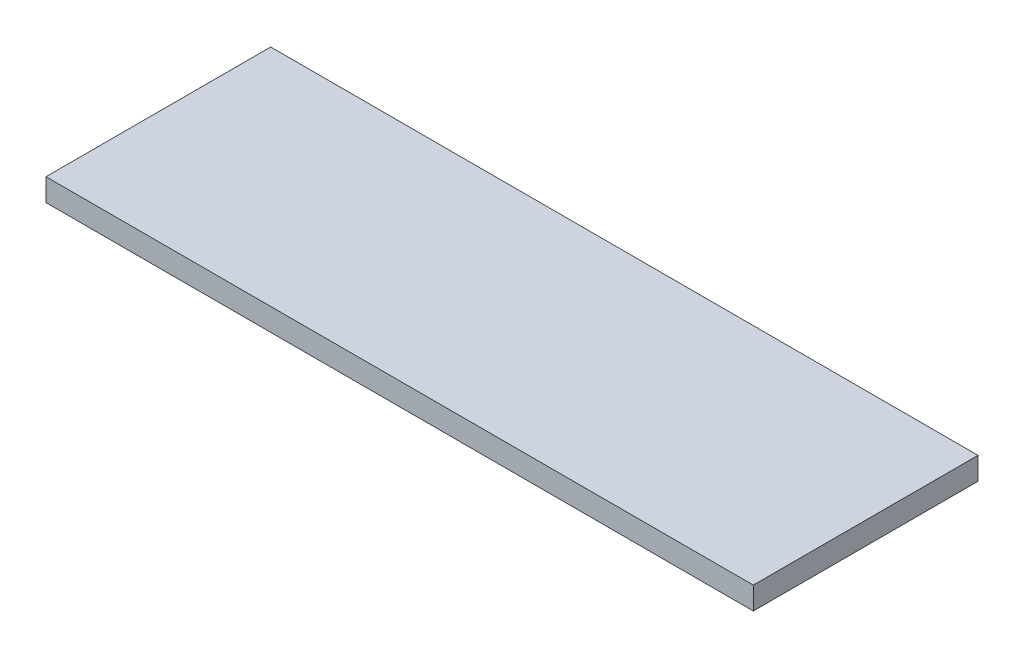
ISO-10303-21;
HEADER;
FILE_DESCRIPTION(('STEP AP214'),'2;1');
FILE_NAME('part.step','',(''),(''),'','','');
FILE_SCHEMA(('AUTOMOTIVE_DESIGN { 1 0 10303 214 1 1 1 1 }'));
ENDSEC;
DATA;
#1=APPLICATION_CONTEXT('core data for automotive mechanical design processes');
#2=APPLICATION_PROTOCOL_DEFINITION('international standard','automotive_design',2000,#1);
#3=PRODUCT_CONTEXT('',#1,'mechanical');
#4=PRODUCT('Part','Part','',(#3));
#5=PRODUCT_RELATED_PRODUCT_CATEGORY('part','',(#4));
#6=PRODUCT_DEFINITION_FORMATION('','',#4);
#7=PRODUCT_DEFINITION_CONTEXT('part definition',#1,'design');
#8=PRODUCT_DEFINITION('design','',#6,#7);
#9=PRODUCT_DEFINITION_SHAPE('','',#8);
#10=(LENGTH_UNIT() NAMED_UNIT(*) SI_UNIT(.MILLI.,.METRE.));
#11=(NAMED_UNIT(*) PLANE_ANGLE_UNIT() SI_UNIT($,.RADIAN.));
#12=(NAMED_UNIT(*) SI_UNIT($,.STERADIAN.) SOLID_ANGLE_UNIT());
#13=UNCERTAINTY_MEASURE_WITH_UNIT(LENGTH_MEASURE(1.E-05),#10,'distance_accuracy_value','');
#14=(GEOMETRIC_REPRESENTATION_CONTEXT(3) GLOBAL_UNCERTAINTY_ASSIGNED_CONTEXT((#13)) GLOBAL_UNIT_ASSIGNED_CONTEXT((#10,
#11,#12)) REPRESENTATION_CONTEXT('',''));
#15=CARTESIAN_POINT('',(0.,0.,0.));
#16=DIRECTION('',(0.,0.,1.));
#17=DIRECTION('',(1.,0.,0.));
#18=AXIS2_PLACEMENT_3D('',#15,#16,#17);
#19=CARTESIAN_POINT('',(236.1,15.,75.));
#20=DIRECTION('',(-1.,0.,0.));
#21=DIRECTION('',(0.,0.,1.));
#22=AXIS2_PLACEMENT_3D('',#19,#20,#21);
#23=PLANE('',#22);
#24=DIRECTION('',(0.,0.,-1.));
#25=VECTOR('',#24,1.);
#26=CARTESIAN_POINT('',(236.1,0.,75.));
#27=LINE('',#26,#25);
#28=CARTESIAN_POINT('',(236.1,0.,75.));
#29=VERTEX_POINT('',#28);
#30=CARTESIAN_POINT('',(236.1,0.,-75.));
#31=VERTEX_POINT('',#30);
#32=EDGE_CURVE('E100',#29,#31,#27,.T.);
#33=ORIENTED_EDGE('',*,*,#32,.T.);
#34=DIRECTION('',(0.,-1.,0.));
#35=VECTOR('',#34,1.);
#36=CARTESIAN_POINT('',(236.1,15.,-75.));
#37=LINE('',#36,#35);
#38=CARTESIAN_POINT('',(236.1,15.,-75.));
#39=VERTEX_POINT('',#38);
#40=EDGE_CURVE('E11',#39,#31,#37,.T.);
#41=ORIENTED_EDGE('',*,*,#40,.F.);
#42=DIRECTION('',(0.,0.,-1.));
#43=VECTOR('',#42,1.);
#44=CARTESIAN_POINT('',(236.1,15.,75.));
#45=LINE('',#44,#43);
#46=CARTESIAN_POINT('',(236.1,15.,75.));
#47=VERTEX_POINT('',#46);
#48=EDGE_CURVE('E88',#47,#39,#45,.T.);
#49=ORIENTED_EDGE('',*,*,#48,.F.);
#50=DIRECTION('',(0.,-1.,0.));
#51=VECTOR('',#50,1.);
#52=CARTESIAN_POINT('',(236.1,15.,75.));
#53=LINE('',#52,#51);
#54=EDGE_CURVE('E96',#47,#29,#53,.T.);
#55=ORIENTED_EDGE('',*,*,#54,.T.);
#56=EDGE_LOOP('',(#33,#41,#49,#55));
#57=FACE_BOUND('',#56,.T.);
#58=ADVANCED_FACE('F37',(#57),#23,.F.);
#59=CARTESIAN_POINT('',(-236.1,15.,-75.));
#60=DIRECTION('',(0.,0.,1.));
#61=DIRECTION('',(1.,0.,0.));
#62=AXIS2_PLACEMENT_3D('',#59,#60,#61);
#63=PLANE('',#62);
#64=DIRECTION('',(-1.,0.,0.));
#65=VECTOR('',#64,1.);
#66=CARTESIAN_POINT('',(-236.1,0.,-75.));
#67=LINE('',#66,#65);
#68=CARTESIAN_POINT('',(-236.1,0.,-75.));
#69=VERTEX_POINT('',#68);
#70=EDGE_CURVE('E92',#31,#69,#67,.T.);
#71=ORIENTED_EDGE('',*,*,#70,.T.);
#72=DIRECTION('',(0.,-1.,0.));
#73=VECTOR('',#72,1.);
#74=CARTESIAN_POINT('',(-236.1,15.,-75.));
#75=LINE('',#74,#73);
#76=CARTESIAN_POINT('',(-236.1,15.,-75.));
#77=VERTEX_POINT('',#76);
#78=EDGE_CURVE('E45',#77,#69,#75,.T.);
#79=ORIENTED_EDGE('',*,*,#78,.F.);
#80=DIRECTION('',(-1.,0.,0.));
#81=VECTOR('',#80,1.);
#82=CARTESIAN_POINT('',(-236.1,15.,-75.));
#83=LINE('',#82,#81);
#84=EDGE_CURVE('E83',#39,#77,#83,.T.);
#85=ORIENTED_EDGE('',*,*,#84,.F.);
#86=ORIENTED_EDGE('',*,*,#40,.T.);
#87=EDGE_LOOP('',(#71,#79,#85,#86));
#88=FACE_BOUND('',#87,.T.);
#89=ADVANCED_FACE('F91',(#88),#63,.F.);
#90=CARTESIAN_POINT('',(-236.1,15.,75.));
#91=DIRECTION('',(1.,0.,0.));
#92=DIRECTION('',(0.,0.,-1.));
#93=AXIS2_PLACEMENT_3D('',#90,#91,#92);
#94=PLANE('',#93);
#95=DIRECTION('',(0.,0.,1.));
#96=VECTOR('',#95,1.);
#97=CARTESIAN_POINT('',(-236.1,0.,75.));
#98=LINE('',#97,#96);
#99=CARTESIAN_POINT('',(-236.1,0.,75.));
#100=VERTEX_POINT('',#99);
#101=EDGE_CURVE('E70',#69,#100,#98,.T.);
#102=ORIENTED_EDGE('',*,*,#101,.T.);
#103=DIRECTION('',(0.,-1.,0.));
#104=VECTOR('',#103,1.);
#105=CARTESIAN_POINT('',(-236.1,15.,75.));
#106=LINE('',#105,#104);
#107=CARTESIAN_POINT('',(-236.1,15.,75.));
#108=VERTEX_POINT('',#107);
#109=EDGE_CURVE('E93',#108,#100,#106,.T.);
#110=ORIENTED_EDGE('',*,*,#109,.F.);
#111=DIRECTION('',(0.,0.,1.));
#112=VECTOR('',#111,1.);
#113=CARTESIAN_POINT('',(-236.1,15.,75.));
#114=LINE('',#113,#112);
#115=EDGE_CURVE('E86',#77,#108,#114,.T.);
#116=ORIENTED_EDGE('',*,*,#115,.F.);
#117=ORIENTED_EDGE('',*,*,#78,.T.);
#118=EDGE_LOOP('',(#102,#110,#116,#117));
#119=FACE_BOUND('',#118,.T.);
#120=ADVANCED_FACE('F94',(#119),#94,.F.);
#121=CARTESIAN_POINT('',(-236.1,15.,75.));
#122=DIRECTION('',(0.,0.,-1.));
#123=DIRECTION('',(-1.,0.,0.));
#124=AXIS2_PLACEMENT_3D('',#121,#122,#123);
#125=PLANE('',#124);
#126=DIRECTION('',(1.,0.,0.));
#127=VECTOR('',#126,1.);
#128=CARTESIAN_POINT('',(-236.1,0.,75.));
#129=LINE('',#128,#127);
#130=EDGE_CURVE('E76',#100,#29,#129,.T.);
#131=ORIENTED_EDGE('',*,*,#130,.T.);
#132=ORIENTED_EDGE('',*,*,#54,.F.);
#133=DIRECTION('',(1.,0.,0.));
#134=VECTOR('',#133,1.);
#135=CARTESIAN_POINT('',(-236.1,15.,75.));
#136=LINE('',#135,#134);
#137=EDGE_CURVE('E53',#108,#47,#136,.T.);
#138=ORIENTED_EDGE('',*,*,#137,.F.);
#139=ORIENTED_EDGE('',*,*,#109,.T.);
#140=EDGE_LOOP('',(#131,#132,#138,#139));
#141=FACE_BOUND('',#140,.T.);
#142=ADVANCED_FACE('F107',(#141),#125,.F.);
#143=CARTESIAN_POINT('',(0.,15.,0.));
#144=DIRECTION('',(0.,-1.,0.));
#145=DIRECTION('',(0.,0.,-1.));
#146=AXIS2_PLACEMENT_3D('',#143,#144,#145);
#147=PLANE('',#146);
#148=ORIENTED_EDGE('',*,*,#48,.T.);
#149=ORIENTED_EDGE('',*,*,#84,.T.);
#150=ORIENTED_EDGE('',*,*,#115,.T.);
#151=ORIENTED_EDGE('',*,*,#137,.T.);
#152=EDGE_LOOP('',(#148,#149,#150,#151));
#153=FACE_BOUND('',#152,.T.);
#154=ADVANCED_FACE('F84',(#153),#147,.F.);
#155=CARTESIAN_POINT('',(0.,0.,0.));
#156=DIRECTION('',(0.,-1.,0.));
#157=DIRECTION('',(0.,0.,-1.));
#158=AXIS2_PLACEMENT_3D('',#155,#156,#157);
#159=PLANE('',#158);
#160=ORIENTED_EDGE('',*,*,#32,.F.);
#161=ORIENTED_EDGE('',*,*,#130,.F.);
#162=ORIENTED_EDGE('',*,*,#101,.F.);
#163=ORIENTED_EDGE('',*,*,#70,.F.);
#164=EDGE_LOOP('',(#160,#161,#162,#163));
#165=FACE_BOUND('',#164,.T.);
#166=ADVANCED_FACE('F110',(#165),#159,.T.);
#167=CLOSED_SHELL('',(#58,#89,#120,#142,#154,#166));
#168=MANIFOLD_SOLID_BREP('B2',#167);
#169=ADVANCED_BREP_SHAPE_REPRESENTATION('',(#18,#168),#14);
#170=SHAPE_DEFINITION_REPRESENTATION(#9,#169);
ENDSEC;
END-ISO-10303-21;
